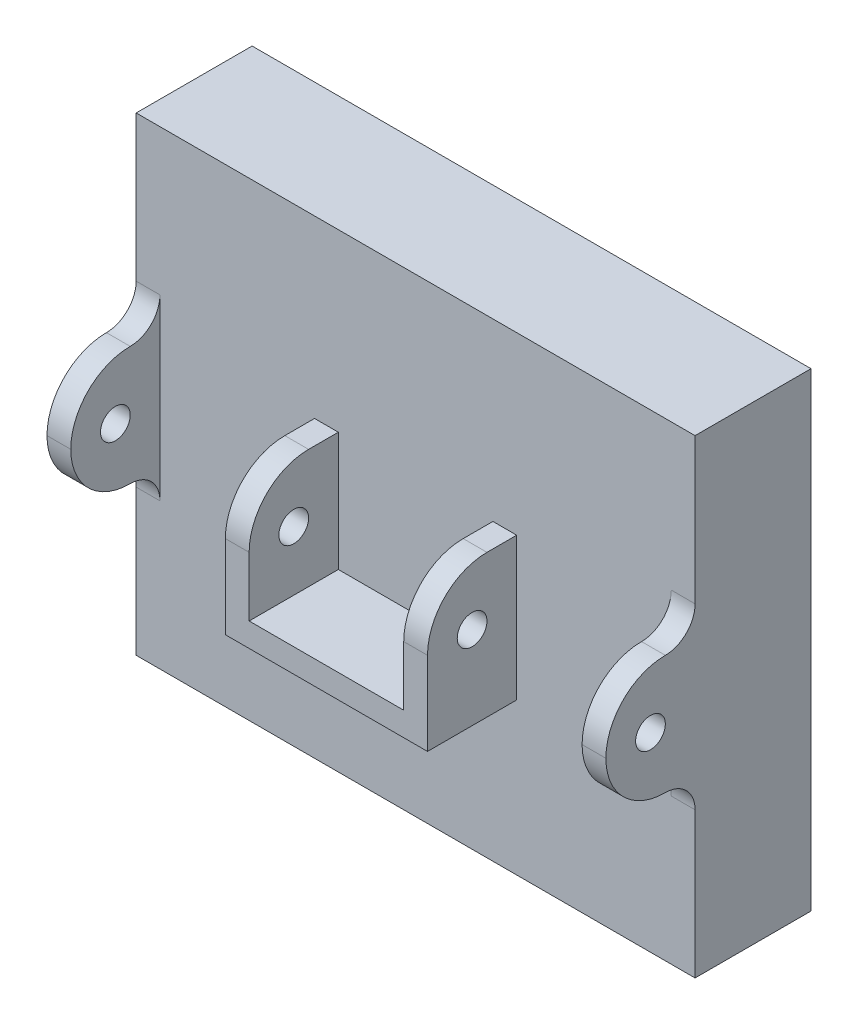
ISO-10303-21;
HEADER;
FILE_DESCRIPTION(('STEP AP214'),'2;1');
FILE_NAME('part.step','',(''),(''),'','','');
FILE_SCHEMA(('AUTOMOTIVE_DESIGN { 1 0 10303 214 1 1 1 1 }'));
ENDSEC;
DATA;
#1=APPLICATION_CONTEXT('core data for automotive mechanical design processes');
#2=APPLICATION_PROTOCOL_DEFINITION('international standard','automotive_design',2000,#1);
#3=PRODUCT_CONTEXT('',#1,'mechanical');
#4=PRODUCT('Part','Part','',(#3));
#5=PRODUCT_RELATED_PRODUCT_CATEGORY('part','',(#4));
#6=PRODUCT_DEFINITION_FORMATION('','',#4);
#7=PRODUCT_DEFINITION_CONTEXT('part definition',#1,'design');
#8=PRODUCT_DEFINITION('design','',#6,#7);
#9=PRODUCT_DEFINITION_SHAPE('','',#8);
#10=(LENGTH_UNIT() NAMED_UNIT(*) SI_UNIT(.MILLI.,.METRE.));
#11=(NAMED_UNIT(*) PLANE_ANGLE_UNIT() SI_UNIT($,.RADIAN.));
#12=(NAMED_UNIT(*) SI_UNIT($,.STERADIAN.) SOLID_ANGLE_UNIT());
#13=UNCERTAINTY_MEASURE_WITH_UNIT(LENGTH_MEASURE(1.E-05),#10,'distance_accuracy_value','');
#14=(GEOMETRIC_REPRESENTATION_CONTEXT(3) GLOBAL_UNCERTAINTY_ASSIGNED_CONTEXT((#13)) GLOBAL_UNIT_ASSIGNED_CONTEXT((#10,
#11,#12)) REPRESENTATION_CONTEXT('',''));
#15=CARTESIAN_POINT('',(0.,0.,0.));
#16=DIRECTION('',(0.,0.,1.));
#17=DIRECTION('',(1.,0.,0.));
#18=AXIS2_PLACEMENT_3D('',#15,#16,#17);
#19=CARTESIAN_POINT('',(0.,0.,39.));
#20=DIRECTION('',(0.,0.,-1.));
#21=DIRECTION('',(-1.,0.,0.));
#22=AXIS2_PLACEMENT_3D('',#19,#20,#21);
#23=PLANE('',#22);
#24=DIRECTION('',(0.,1.,0.));
#25=VECTOR('',#24,1.);
#26=CARTESIAN_POINT('',(34.,20.0000000000017,39.));
#27=LINE('',#26,#25);
#28=CARTESIAN_POINT('',(34.,-27.9999999999992,39.));
#29=VERTEX_POINT('',#28);
#30=CARTESIAN_POINT('',(34.,20.0000000000017,39.));
#31=VERTEX_POINT('',#30);
#32=EDGE_CURVE('E251',#29,#31,#27,.T.);
#33=ORIENTED_EDGE('',*,*,#32,.F.);
#34=DIRECTION('',(1.,0.,0.));
#35=VECTOR('',#34,1.);
#36=CARTESIAN_POINT('',(-34.,-27.9999999999992,39.));
#37=LINE('',#36,#35);
#38=CARTESIAN_POINT('',(-34.,-27.9999999999992,39.));
#39=VERTEX_POINT('',#38);
#40=EDGE_CURVE('E269',#39,#29,#37,.T.);
#41=ORIENTED_EDGE('',*,*,#40,.F.);
#42=DIRECTION('',(0.,-1.,0.));
#43=VECTOR('',#42,1.);
#44=CARTESIAN_POINT('',(-34.,-19.9999999999992,39.));
#45=LINE('',#44,#43);
#46=CARTESIAN_POINT('',(-34.,20.0000000000008,39.));
#47=VERTEX_POINT('',#46);
#48=EDGE_CURVE('E266',#47,#39,#45,.T.);
#49=ORIENTED_EDGE('',*,*,#48,.F.);
#50=DIRECTION('',(-1.,0.,0.));
#51=VECTOR('',#50,1.);
#52=CARTESIAN_POINT('',(-34.,20.0000000000008,39.));
#53=LINE('',#52,#51);
#54=CARTESIAN_POINT('',(-26.,20.0000000000008,39.));
#55=VERTEX_POINT('',#54);
#56=EDGE_CURVE('E263',#55,#47,#53,.T.);
#57=ORIENTED_EDGE('',*,*,#56,.F.);
#58=DIRECTION('',(0.,1.,0.));
#59=VECTOR('',#58,1.);
#60=CARTESIAN_POINT('',(-26.,20.0000000000008,39.));
#61=LINE('',#60,#59);
#62=CARTESIAN_POINT('',(-26.,-19.9999999999992,39.));
#63=VERTEX_POINT('',#62);
#64=EDGE_CURVE('E260',#63,#55,#61,.T.);
#65=ORIENTED_EDGE('',*,*,#64,.F.);
#66=DIRECTION('',(-1.,0.,0.));
#67=VECTOR('',#66,1.);
#68=CARTESIAN_POINT('',(-26.,-19.9999999999992,39.));
#69=LINE('',#68,#67);
#70=CARTESIAN_POINT('',(26.,-19.9999999999983,39.));
#71=VERTEX_POINT('',#70);
#72=EDGE_CURVE('E258',#71,#63,#69,.T.);
#73=ORIENTED_EDGE('',*,*,#72,.F.);
#74=DIRECTION('',(0.,-1.,0.));
#75=VECTOR('',#74,1.);
#76=CARTESIAN_POINT('',(26.,20.0000000000017,39.));
#77=LINE('',#76,#75);
#78=CARTESIAN_POINT('',(26.,20.0000000000017,39.));
#79=VERTEX_POINT('',#78);
#80=EDGE_CURVE('E232',#79,#71,#77,.T.);
#81=ORIENTED_EDGE('',*,*,#80,.F.);
#82=DIRECTION('',(-1.,0.,0.));
#83=VECTOR('',#82,1.);
#84=CARTESIAN_POINT('',(26.,20.0000000000017,39.));
#85=LINE('',#84,#83);
#86=EDGE_CURVE('E254',#31,#79,#85,.T.);
#87=ORIENTED_EDGE('',*,*,#86,.F.);
#88=EDGE_LOOP('',(#33,#41,#49,#57,#65,#73,#81,#87));
#89=FACE_BOUND('',#88,.T.);
#90=DIRECTION('',(0.,-1.,0.));
#91=VECTOR('',#90,1.);
#92=CARTESIAN_POINT('',(86.,20.0000000000025,39.));
#93=LINE('',#92,#91);
#94=CARTESIAN_POINT('',(86.,30.0000000000025,39.));
#95=VERTEX_POINT('',#94);
#96=CARTESIAN_POINT('',(86.,-29.9999999999975,39.));
#97=VERTEX_POINT('',#96);
#98=EDGE_CURVE('E48',#95,#97,#93,.T.);
#99=ORIENTED_EDGE('',*,*,#98,.F.);
#100=DIRECTION('',(-1.,0.,0.));
#101=VECTOR('',#100,1.);
#102=CARTESIAN_POINT('',(94.,30.0000000000025,39.));
#103=LINE('',#102,#101);
#104=CARTESIAN_POINT('',(94.,30.0000000000025,39.));
#105=VERTEX_POINT('',#104);
#106=EDGE_CURVE('E417',#95,#105,#103,.F.);
#107=ORIENTED_EDGE('',*,*,#106,.T.);
#108=DIRECTION('',(0.,1.,0.));
#109=VECTOR('',#108,1.);
#110=CARTESIAN_POINT('',(94.,-79.,39.));
#111=LINE('',#110,#109);
#112=CARTESIAN_POINT('',(94.,79.,39.));
#113=VERTEX_POINT('',#112);
#114=EDGE_CURVE('E322',#105,#113,#111,.T.);
#115=ORIENTED_EDGE('',*,*,#114,.T.);
#116=DIRECTION('',(-1.,0.,0.));
#117=VECTOR('',#116,1.);
#118=CARTESIAN_POINT('',(-94.,79.,39.));
#119=LINE('',#118,#117);
#120=CARTESIAN_POINT('',(-94.,79.,39.));
#121=VERTEX_POINT('',#120);
#122=EDGE_CURVE('E321',#113,#121,#119,.T.);
#123=ORIENTED_EDGE('',*,*,#122,.T.);
#124=DIRECTION('',(0.,-1.,0.));
#125=VECTOR('',#124,1.);
#126=CARTESIAN_POINT('',(-94.,-79.,39.));
#127=LINE('',#126,#125);
#128=CARTESIAN_POINT('',(-94.,30.,39.));
#129=VERTEX_POINT('',#128);
#130=EDGE_CURVE('E325',#121,#129,#127,.T.);
#131=ORIENTED_EDGE('',*,*,#130,.T.);
#132=DIRECTION('',(-1.,0.,0.));
#133=VECTOR('',#132,1.);
#134=CARTESIAN_POINT('',(-86.,30.,39.));
#135=LINE('',#134,#133);
#136=CARTESIAN_POINT('',(-86.,30.,39.));
#137=VERTEX_POINT('',#136);
#138=EDGE_CURVE('E412',#129,#137,#135,.F.);
#139=ORIENTED_EDGE('',*,*,#138,.T.);
#140=DIRECTION('',(0.,1.,0.));
#141=VECTOR('',#140,1.);
#142=CARTESIAN_POINT('',(-86.,20.,39.));
#143=LINE('',#142,#141);
#144=CARTESIAN_POINT('',(-86.,-30.,39.));
#145=VERTEX_POINT('',#144);
#146=EDGE_CURVE('E285',#145,#137,#143,.T.);
#147=ORIENTED_EDGE('',*,*,#146,.F.);
#148=DIRECTION('',(1.,0.,0.));
#149=VECTOR('',#148,1.);
#150=CARTESIAN_POINT('',(-94.,-30.,39.));
#151=LINE('',#150,#149);
#152=CARTESIAN_POINT('',(-94.,-30.,39.));
#153=VERTEX_POINT('',#152);
#154=EDGE_CURVE('E398',#145,#153,#151,.F.);
#155=ORIENTED_EDGE('',*,*,#154,.T.);
#156=CARTESIAN_POINT('',(-94.,-79.,39.));
#157=VERTEX_POINT('',#156);
#158=EDGE_CURVE('E324',#153,#157,#127,.T.);
#159=ORIENTED_EDGE('',*,*,#158,.T.);
#160=DIRECTION('',(1.,0.,0.));
#161=VECTOR('',#160,1.);
#162=CARTESIAN_POINT('',(-94.,-79.,39.));
#163=LINE('',#162,#161);
#164=CARTESIAN_POINT('',(94.,-79.,39.));
#165=VERTEX_POINT('',#164);
#166=EDGE_CURVE('E328',#157,#165,#163,.T.);
#167=ORIENTED_EDGE('',*,*,#166,.T.);
#168=CARTESIAN_POINT('',(94.,-29.9999999999975,39.));
#169=VERTEX_POINT('',#168);
#170=EDGE_CURVE('E318',#165,#169,#111,.T.);
#171=ORIENTED_EDGE('',*,*,#170,.T.);
#172=DIRECTION('',(1.,0.,0.));
#173=VECTOR('',#172,1.);
#174=CARTESIAN_POINT('',(86.,-29.9999999999975,39.));
#175=LINE('',#174,#173);
#176=EDGE_CURVE('E415',#169,#97,#175,.F.);
#177=ORIENTED_EDGE('',*,*,#176,.T.);
#178=EDGE_LOOP('',(#99,#107,#115,#123,#131,#139,#147,#155,#159,#167,#171,#177));
#179=FACE_BOUND('',#178,.T.);
#180=ADVANCED_FACE('F33',(#89,#179),#23,.F.);
#181=CARTESIAN_POINT('',(94.,-79.,39.));
#182=DIRECTION('',(-1.,0.,0.));
#183=DIRECTION('',(0.,0.,1.));
#184=AXIS2_PLACEMENT_3D('',#181,#182,#183);
#185=PLANE('',#184);
#186=CARTESIAN_POINT('',(94.,0.,54.));
#187=DIRECTION('',(-1.,0.,0.));
#188=DIRECTION('',(0.,0.,1.));
#189=AXIS2_PLACEMENT_3D('',#186,#187,#188);
#190=CIRCLE('',#189,5.);
#191=CARTESIAN_POINT('',(94.,0.,59.));
#192=VERTEX_POINT('',#191);
#193=EDGE_CURVE('E405',#192,#192,#190,.T.);
#194=ORIENTED_EDGE('',*,*,#193,.T.);
#195=EDGE_LOOP('',(#194));
#196=FACE_BOUND('',#195,.T.);
#197=CARTESIAN_POINT('',(94.,2.51881848711832E-12,49.));
#198=DIRECTION('',(-1.,0.,0.));
#199=DIRECTION('',(0.,0.,1.));
#200=AXIS2_PLACEMENT_3D('',#197,#198,#199);
#201=CIRCLE('',#200,20.);
#202=CARTESIAN_POINT('',(94.,20.0000000000025,49.));
#203=VERTEX_POINT('',#202);
#204=CARTESIAN_POINT('',(94.,2.51881848711832E-12,69.));
#205=VERTEX_POINT('',#204);
#206=EDGE_CURVE('E366',#203,#205,#201,.F.);
#207=ORIENTED_EDGE('',*,*,#206,.T.);
#208=CARTESIAN_POINT('',(94.,2.51881848711832E-12,49.));
#209=DIRECTION('',(-1.,0.,0.));
#210=DIRECTION('',(0.,0.,1.));
#211=AXIS2_PLACEMENT_3D('',#208,#209,#210);
#212=CIRCLE('',#211,20.);
#213=CARTESIAN_POINT('',(94.,-19.9999999999975,49.));
#214=VERTEX_POINT('',#213);
#215=EDGE_CURVE('E368',#205,#214,#212,.F.);
#216=ORIENTED_EDGE('',*,*,#215,.T.);
#217=CARTESIAN_POINT('',(94.,-29.9999999999975,49.));
#218=DIRECTION('',(-1.,0.,0.));
#219=DIRECTION('',(0.,0.,1.));
#220=AXIS2_PLACEMENT_3D('',#217,#218,#219);
#221=CIRCLE('',#220,10.);
#222=EDGE_CURVE('E423',#214,#169,#221,.T.);
#223=ORIENTED_EDGE('',*,*,#222,.T.);
#224=ORIENTED_EDGE('',*,*,#170,.F.);
#225=DIRECTION('',(0.,0.,-1.));
#226=VECTOR('',#225,1.);
#227=CARTESIAN_POINT('',(94.,-79.,39.));
#228=LINE('',#227,#226);
#229=CARTESIAN_POINT('',(94.,-79.,0.));
#230=VERTEX_POINT('',#229);
#231=EDGE_CURVE('E330',#165,#230,#228,.T.);
#232=ORIENTED_EDGE('',*,*,#231,.T.);
#233=DIRECTION('',(0.,1.,0.));
#234=VECTOR('',#233,1.);
#235=CARTESIAN_POINT('',(94.,-79.,0.));
#236=LINE('',#235,#234);
#237=CARTESIAN_POINT('',(94.,79.,0.));
#238=VERTEX_POINT('',#237);
#239=EDGE_CURVE('E317',#230,#238,#236,.T.);
#240=ORIENTED_EDGE('',*,*,#239,.T.);
#241=DIRECTION('',(0.,0.,-1.));
#242=VECTOR('',#241,1.);
#243=CARTESIAN_POINT('',(94.,79.,39.));
#244=LINE('',#243,#242);
#245=EDGE_CURVE('E347',#113,#238,#244,.T.);
#246=ORIENTED_EDGE('',*,*,#245,.F.);
#247=ORIENTED_EDGE('',*,*,#114,.F.);
#248=CARTESIAN_POINT('',(94.,30.0000000000025,49.));
#249=DIRECTION('',(-1.,0.,0.));
#250=DIRECTION('',(0.,0.,1.));
#251=AXIS2_PLACEMENT_3D('',#248,#249,#250);
#252=CIRCLE('',#251,10.);
#253=EDGE_CURVE('E421',#105,#203,#252,.T.);
#254=ORIENTED_EDGE('',*,*,#253,.T.);
#255=EDGE_LOOP('',(#207,#216,#223,#224,#232,#240,#246,#247,#254));
#256=FACE_BOUND('',#255,.T.);
#257=ADVANCED_FACE('F474',(#196,#256),#185,.F.);
#258=CARTESIAN_POINT('',(-94.,79.,39.));
#259=DIRECTION('',(0.,-1.,0.));
#260=DIRECTION('',(0.,0.,-1.));
#261=AXIS2_PLACEMENT_3D('',#258,#259,#260);
#262=PLANE('',#261);
#263=DIRECTION('',(-1.,0.,0.));
#264=VECTOR('',#263,1.);
#265=CARTESIAN_POINT('',(-94.,79.,0.));
#266=LINE('',#265,#264);
#267=CARTESIAN_POINT('',(-94.,79.,0.));
#268=VERTEX_POINT('',#267);
#269=EDGE_CURVE('E333',#238,#268,#266,.T.);
#270=ORIENTED_EDGE('',*,*,#269,.T.);
#271=DIRECTION('',(0.,0.,-1.));
#272=VECTOR('',#271,1.);
#273=CARTESIAN_POINT('',(-94.,79.,39.));
#274=LINE('',#273,#272);
#275=EDGE_CURVE('E344',#121,#268,#274,.T.);
#276=ORIENTED_EDGE('',*,*,#275,.F.);
#277=ORIENTED_EDGE('',*,*,#122,.F.);
#278=ORIENTED_EDGE('',*,*,#245,.T.);
#279=EDGE_LOOP('',(#270,#276,#277,#278));
#280=FACE_BOUND('',#279,.T.);
#281=ADVANCED_FACE('F477',(#280),#262,.F.);
#282=CARTESIAN_POINT('',(-94.,-79.,39.));
#283=DIRECTION('',(1.,0.,0.));
#284=DIRECTION('',(0.,0.,-1.));
#285=AXIS2_PLACEMENT_3D('',#282,#283,#284);
#286=PLANE('',#285);
#287=CARTESIAN_POINT('',(-94.,0.,54.));
#288=DIRECTION('',(-1.,0.,0.));
#289=DIRECTION('',(0.,0.,1.));
#290=AXIS2_PLACEMENT_3D('',#287,#288,#289);
#291=CIRCLE('',#290,5.);
#292=CARTESIAN_POINT('',(-94.,0.,59.));
#293=VERTEX_POINT('',#292);
#294=EDGE_CURVE('E410',#293,#293,#291,.T.);
#295=ORIENTED_EDGE('',*,*,#294,.F.);
#296=EDGE_LOOP('',(#295));
#297=FACE_BOUND('',#296,.T.);
#298=ORIENTED_EDGE('',*,*,#158,.F.);
#299=CARTESIAN_POINT('',(-94.,-30.,49.));
#300=DIRECTION('',(1.,0.,0.));
#301=DIRECTION('',(0.,0.,-1.));
#302=AXIS2_PLACEMENT_3D('',#299,#300,#301);
#303=CIRCLE('',#302,10.);
#304=CARTESIAN_POINT('',(-94.,-20.,49.));
#305=VERTEX_POINT('',#304);
#306=EDGE_CURVE('E11',#153,#305,#303,.T.);
#307=ORIENTED_EDGE('',*,*,#306,.T.);
#308=CARTESIAN_POINT('',(-94.,0.,49.));
#309=DIRECTION('',(1.,0.,0.));
#310=DIRECTION('',(0.,0.,-1.));
#311=AXIS2_PLACEMENT_3D('',#308,#309,#310);
#312=CIRCLE('',#311,20.);
#313=CARTESIAN_POINT('',(-94.,0.,69.));
#314=VERTEX_POINT('',#313);
#315=EDGE_CURVE('E393',#305,#314,#312,.F.);
#316=ORIENTED_EDGE('',*,*,#315,.T.);
#317=CARTESIAN_POINT('',(-94.,0.,49.));
#318=DIRECTION('',(1.,0.,0.));
#319=DIRECTION('',(0.,0.,-1.));
#320=AXIS2_PLACEMENT_3D('',#317,#318,#319);
#321=CIRCLE('',#320,20.);
#322=CARTESIAN_POINT('',(-94.,20.,49.));
#323=VERTEX_POINT('',#322);
#324=EDGE_CURVE('E390',#314,#323,#321,.F.);
#325=ORIENTED_EDGE('',*,*,#324,.T.);
#326=CARTESIAN_POINT('',(-94.,30.,49.));
#327=DIRECTION('',(1.,0.,0.));
#328=DIRECTION('',(0.,0.,-1.));
#329=AXIS2_PLACEMENT_3D('',#326,#327,#328);
#330=CIRCLE('',#329,10.);
#331=EDGE_CURVE('E427',#323,#129,#330,.T.);
#332=ORIENTED_EDGE('',*,*,#331,.T.);
#333=ORIENTED_EDGE('',*,*,#130,.F.);
#334=ORIENTED_EDGE('',*,*,#275,.T.);
#335=DIRECTION('',(0.,-1.,0.));
#336=VECTOR('',#335,1.);
#337=CARTESIAN_POINT('',(-94.,-79.,0.));
#338=LINE('',#337,#336);
#339=CARTESIAN_POINT('',(-94.,-79.,0.));
#340=VERTEX_POINT('',#339);
#341=EDGE_CURVE('E335',#268,#340,#338,.T.);
#342=ORIENTED_EDGE('',*,*,#341,.T.);
#343=DIRECTION('',(0.,0.,-1.));
#344=VECTOR('',#343,1.);
#345=CARTESIAN_POINT('',(-94.,-79.,39.));
#346=LINE('',#345,#344);
#347=EDGE_CURVE('E341',#157,#340,#346,.T.);
#348=ORIENTED_EDGE('',*,*,#347,.F.);
#349=EDGE_LOOP('',(#298,#307,#316,#325,#332,#333,#334,#342,#348));
#350=FACE_BOUND('',#349,.T.);
#351=ADVANCED_FACE('F441',(#297,#350),#286,.F.);
#352=CARTESIAN_POINT('',(-94.,-79.,39.));
#353=DIRECTION('',(0.,1.,0.));
#354=DIRECTION('',(0.,0.,1.));
#355=AXIS2_PLACEMENT_3D('',#352,#353,#354);
#356=PLANE('',#355);
#357=DIRECTION('',(1.,0.,0.));
#358=VECTOR('',#357,1.);
#359=CARTESIAN_POINT('',(-94.,-79.,0.));
#360=LINE('',#359,#358);
#361=EDGE_CURVE('E337',#340,#230,#360,.T.);
#362=ORIENTED_EDGE('',*,*,#361,.T.);
#363=ORIENTED_EDGE('',*,*,#231,.F.);
#364=ORIENTED_EDGE('',*,*,#166,.F.);
#365=ORIENTED_EDGE('',*,*,#347,.T.);
#366=EDGE_LOOP('',(#362,#363,#364,#365));
#367=FACE_BOUND('',#366,.T.);
#368=ADVANCED_FACE('F448',(#367),#356,.F.);
#369=CARTESIAN_POINT('',(0.,0.,0.));
#370=DIRECTION('',(0.,0.,-1.));
#371=DIRECTION('',(-1.,0.,0.));
#372=AXIS2_PLACEMENT_3D('',#369,#370,#371);
#373=PLANE('',#372);
#374=DIRECTION('',(0.,-1.,0.));
#375=VECTOR('',#374,1.);
#376=CARTESIAN_POINT('',(90.,0.,0.));
#377=LINE('',#376,#375);
#378=CARTESIAN_POINT('',(90.,75.,0.));
#379=VERTEX_POINT('',#378);
#380=CARTESIAN_POINT('',(90.,-75.,0.));
#381=VERTEX_POINT('',#380);
#382=EDGE_CURVE('E287',#379,#381,#377,.T.);
#383=ORIENTED_EDGE('',*,*,#382,.F.);
#384=DIRECTION('',(1.,0.,0.));
#385=VECTOR('',#384,1.);
#386=CARTESIAN_POINT('',(0.,75.,0.));
#387=LINE('',#386,#385);
#388=CARTESIAN_POINT('',(-90.,75.,0.));
#389=VERTEX_POINT('',#388);
#390=EDGE_CURVE('E301',#389,#379,#387,.T.);
#391=ORIENTED_EDGE('',*,*,#390,.F.);
#392=DIRECTION('',(0.,-1.,0.));
#393=VECTOR('',#392,1.);
#394=CARTESIAN_POINT('',(-90.,0.,0.));
#395=LINE('',#394,#393);
#396=CARTESIAN_POINT('',(-90.,-75.,0.));
#397=VERTEX_POINT('',#396);
#398=EDGE_CURVE('E304',#389,#397,#395,.T.);
#399=ORIENTED_EDGE('',*,*,#398,.T.);
#400=DIRECTION('',(1.,0.,0.));
#401=VECTOR('',#400,1.);
#402=CARTESIAN_POINT('',(0.,-75.,0.));
#403=LINE('',#402,#401);
#404=EDGE_CURVE('E292',#397,#381,#403,.T.);
#405=ORIENTED_EDGE('',*,*,#404,.T.);
#406=EDGE_LOOP('',(#383,#391,#399,#405));
#407=FACE_BOUND('',#406,.T.);
#408=ORIENTED_EDGE('',*,*,#239,.F.);
#409=ORIENTED_EDGE('',*,*,#361,.F.);
#410=ORIENTED_EDGE('',*,*,#341,.F.);
#411=ORIENTED_EDGE('',*,*,#269,.F.);
#412=EDGE_LOOP('',(#408,#409,#410,#411));
#413=FACE_BOUND('',#412,.T.);
#414=ADVANCED_FACE('F517',(#407,#413),#373,.T.);
#415=CARTESIAN_POINT('',(90.,0.,35.));
#416=DIRECTION('',(1.,0.,0.));
#417=DIRECTION('',(0.,0.,-1.));
#418=AXIS2_PLACEMENT_3D('',#415,#416,#417);
#419=PLANE('',#418);
#420=ORIENTED_EDGE('',*,*,#382,.T.);
#421=DIRECTION('',(0.,0.,-1.));
#422=VECTOR('',#421,1.);
#423=CARTESIAN_POINT('',(90.,-75.,35.));
#424=LINE('',#423,#422);
#425=CARTESIAN_POINT('',(90.,-75.,35.));
#426=VERTEX_POINT('',#425);
#427=EDGE_CURVE('E299',#426,#381,#424,.T.);
#428=ORIENTED_EDGE('',*,*,#427,.F.);
#429=DIRECTION('',(0.,-1.,0.));
#430=VECTOR('',#429,1.);
#431=CARTESIAN_POINT('',(90.,0.,35.));
#432=LINE('',#431,#430);
#433=CARTESIAN_POINT('',(90.,75.,35.));
#434=VERTEX_POINT('',#433);
#435=EDGE_CURVE('E288',#434,#426,#432,.T.);
#436=ORIENTED_EDGE('',*,*,#435,.F.);
#437=DIRECTION('',(0.,0.,-1.));
#438=VECTOR('',#437,1.);
#439=CARTESIAN_POINT('',(90.,75.,35.));
#440=LINE('',#439,#438);
#441=EDGE_CURVE('E315',#434,#379,#440,.T.);
#442=ORIENTED_EDGE('',*,*,#441,.T.);
#443=EDGE_LOOP('',(#420,#428,#436,#442));
#444=FACE_BOUND('',#443,.T.);
#445=ADVANCED_FACE('F515',(#444),#419,.F.);
#446=CARTESIAN_POINT('',(0.,75.,35.));
#447=DIRECTION('',(0.,1.,0.));
#448=DIRECTION('',(-1.,0.,0.));
#449=AXIS2_PLACEMENT_3D('',#446,#447,#448);
#450=PLANE('',#449);
#451=ORIENTED_EDGE('',*,*,#390,.T.);
#452=ORIENTED_EDGE('',*,*,#441,.F.);
#453=DIRECTION('',(1.,0.,0.));
#454=VECTOR('',#453,1.);
#455=CARTESIAN_POINT('',(0.,75.,35.));
#456=LINE('',#455,#454);
#457=CARTESIAN_POINT('',(-90.,75.,35.));
#458=VERTEX_POINT('',#457);
#459=EDGE_CURVE('E291',#458,#434,#456,.T.);
#460=ORIENTED_EDGE('',*,*,#459,.F.);
#461=DIRECTION('',(0.,0.,-1.));
#462=VECTOR('',#461,1.);
#463=CARTESIAN_POINT('',(-90.,75.,35.));
#464=LINE('',#463,#462);
#465=EDGE_CURVE('E313',#458,#389,#464,.T.);
#466=ORIENTED_EDGE('',*,*,#465,.T.);
#467=EDGE_LOOP('',(#451,#452,#460,#466));
#468=FACE_BOUND('',#467,.T.);
#469=ADVANCED_FACE('F742',(#468),#450,.F.);
#470=CARTESIAN_POINT('',(-90.,0.,35.));
#471=DIRECTION('',(1.,0.,0.));
#472=DIRECTION('',(0.,1.,0.));
#473=AXIS2_PLACEMENT_3D('',#470,#471,#472);
#474=PLANE('',#473);
#475=ORIENTED_EDGE('',*,*,#398,.F.);
#476=ORIENTED_EDGE('',*,*,#465,.F.);
#477=DIRECTION('',(0.,-1.,0.));
#478=VECTOR('',#477,1.);
#479=CARTESIAN_POINT('',(-90.,0.,35.));
#480=LINE('',#479,#478);
#481=CARTESIAN_POINT('',(-90.,-75.,35.));
#482=VERTEX_POINT('',#481);
#483=EDGE_CURVE('E295',#458,#482,#480,.T.);
#484=ORIENTED_EDGE('',*,*,#483,.T.);
#485=DIRECTION('',(0.,0.,-1.));
#486=VECTOR('',#485,1.);
#487=CARTESIAN_POINT('',(-90.,-75.,35.));
#488=LINE('',#487,#486);
#489=EDGE_CURVE('E311',#482,#397,#488,.T.);
#490=ORIENTED_EDGE('',*,*,#489,.T.);
#491=EDGE_LOOP('',(#475,#476,#484,#490));
#492=FACE_BOUND('',#491,.T.);
#493=ADVANCED_FACE('F732',(#492),#474,.T.);
#494=CARTESIAN_POINT('',(0.,-75.,35.));
#495=DIRECTION('',(0.,1.,0.));
#496=DIRECTION('',(-1.,0.,0.));
#497=AXIS2_PLACEMENT_3D('',#494,#495,#496);
#498=PLANE('',#497);
#499=ORIENTED_EDGE('',*,*,#404,.F.);
#500=ORIENTED_EDGE('',*,*,#489,.F.);
#501=DIRECTION('',(1.,0.,0.));
#502=VECTOR('',#501,1.);
#503=CARTESIAN_POINT('',(0.,-75.,35.));
#504=LINE('',#503,#502);
#505=EDGE_CURVE('E297',#482,#426,#504,.T.);
#506=ORIENTED_EDGE('',*,*,#505,.T.);
#507=ORIENTED_EDGE('',*,*,#427,.T.);
#508=EDGE_LOOP('',(#499,#500,#506,#507));
#509=FACE_BOUND('',#508,.T.);
#510=ADVANCED_FACE('F721',(#509),#498,.T.);
#511=CARTESIAN_POINT('',(0.,0.,35.));
#512=DIRECTION('',(0.,0.,1.));
#513=DIRECTION('',(1.,0.,0.));
#514=AXIS2_PLACEMENT_3D('',#511,#512,#513);
#515=PLANE('',#514);
#516=ORIENTED_EDGE('',*,*,#435,.T.);
#517=ORIENTED_EDGE('',*,*,#505,.F.);
#518=ORIENTED_EDGE('',*,*,#483,.F.);
#519=ORIENTED_EDGE('',*,*,#459,.T.);
#520=EDGE_LOOP('',(#516,#517,#518,#519));
#521=FACE_BOUND('',#520,.T.);
#522=ADVANCED_FACE('F716',(#521),#515,.F.);
#523=CARTESIAN_POINT('',(-86.,20.,69.));
#524=DIRECTION('',(-1.,0.,0.));
#525=DIRECTION('',(0.,0.,1.));
#526=AXIS2_PLACEMENT_3D('',#523,#524,#525);
#527=PLANE('',#526);
#528=CARTESIAN_POINT('',(-86.,0.,54.));
#529=DIRECTION('',(-1.,0.,0.));
#530=DIRECTION('',(0.,0.,1.));
#531=AXIS2_PLACEMENT_3D('',#528,#529,#530);
#532=CIRCLE('',#531,5.);
#533=CARTESIAN_POINT('',(-86.,0.,59.));
#534=VERTEX_POINT('',#533);
#535=EDGE_CURVE('E811',#534,#534,#532,.T.);
#536=ORIENTED_EDGE('',*,*,#535,.T.);
#537=EDGE_LOOP('',(#536));
#538=FACE_BOUND('',#537,.T.);
#539=CARTESIAN_POINT('',(-86.,0.,49.));
#540=DIRECTION('',(-1.,0.,0.));
#541=DIRECTION('',(0.,0.,1.));
#542=AXIS2_PLACEMENT_3D('',#539,#540,#541);
#543=CIRCLE('',#542,20.);
#544=CARTESIAN_POINT('',(-86.,20.,49.));
#545=VERTEX_POINT('',#544);
#546=CARTESIAN_POINT('',(-86.,0.,69.));
#547=VERTEX_POINT('',#546);
#548=EDGE_CURVE('E382',#545,#547,#543,.F.);
#549=ORIENTED_EDGE('',*,*,#548,.T.);
#550=CARTESIAN_POINT('',(-86.,0.,49.));
#551=DIRECTION('',(-1.,0.,0.));
#552=DIRECTION('',(0.,0.,1.));
#553=AXIS2_PLACEMENT_3D('',#550,#551,#552);
#554=CIRCLE('',#553,20.);
#555=CARTESIAN_POINT('',(-86.,-20.,49.));
#556=VERTEX_POINT('',#555);
#557=EDGE_CURVE('E384',#547,#556,#554,.F.);
#558=ORIENTED_EDGE('',*,*,#557,.T.);
#559=CARTESIAN_POINT('',(-86.,-30.,49.));
#560=DIRECTION('',(-1.,0.,0.));
#561=DIRECTION('',(0.,0.,1.));
#562=AXIS2_PLACEMENT_3D('',#559,#560,#561);
#563=CIRCLE('',#562,10.);
#564=EDGE_CURVE('E41',#556,#145,#563,.T.);
#565=ORIENTED_EDGE('',*,*,#564,.T.);
#566=ORIENTED_EDGE('',*,*,#146,.T.);
#567=CARTESIAN_POINT('',(-86.,30.,49.));
#568=DIRECTION('',(-1.,0.,0.));
#569=DIRECTION('',(0.,0.,1.));
#570=AXIS2_PLACEMENT_3D('',#567,#568,#569);
#571=CIRCLE('',#570,10.);
#572=EDGE_CURVE('E429',#137,#545,#571,.T.);
#573=ORIENTED_EDGE('',*,*,#572,.T.);
#574=EDGE_LOOP('',(#549,#558,#565,#566,#573));
#575=FACE_BOUND('',#574,.T.);
#576=ADVANCED_FACE('F433',(#538,#575),#527,.F.);
#577=CARTESIAN_POINT('',(34.,20.0000000000017,69.));
#578=DIRECTION('',(-1.,0.,0.));
#579=DIRECTION('',(0.,0.,1.));
#580=AXIS2_PLACEMENT_3D('',#577,#578,#579);
#581=PLANE('',#580);
#582=CARTESIAN_POINT('',(34.,0.,54.));
#583=DIRECTION('',(-1.,0.,0.));
#584=DIRECTION('',(0.,0.,1.));
#585=AXIS2_PLACEMENT_3D('',#582,#583,#584);
#586=CIRCLE('',#585,5.);
#587=CARTESIAN_POINT('',(34.,0.,59.));
#588=VERTEX_POINT('',#587);
#589=EDGE_CURVE('E814',#588,#588,#586,.T.);
#590=ORIENTED_EDGE('',*,*,#589,.T.);
#591=EDGE_LOOP('',(#590));
#592=FACE_BOUND('',#591,.T.);
#593=DIRECTION('',(0.,0.,-1.));
#594=VECTOR('',#593,1.);
#595=CARTESIAN_POINT('',(34.,20.0000000000017,69.));
#596=LINE('',#595,#594);
#597=CARTESIAN_POINT('',(34.,20.0000000000017,49.));
#598=VERTEX_POINT('',#597);
#599=EDGE_CURVE('E283',#598,#31,#596,.T.);
#600=ORIENTED_EDGE('',*,*,#599,.F.);
#601=CARTESIAN_POINT('',(34.,1.67921232474555E-12,49.));
#602=DIRECTION('',(-1.,0.,0.));
#603=DIRECTION('',(0.,0.,1.));
#604=AXIS2_PLACEMENT_3D('',#601,#602,#603);
#605=CIRCLE('',#604,20.);
#606=CARTESIAN_POINT('',(34.,1.67921232474555E-12,69.));
#607=VERTEX_POINT('',#606);
#608=EDGE_CURVE('E358',#598,#607,#605,.F.);
#609=ORIENTED_EDGE('',*,*,#608,.T.);
#610=DIRECTION('',(0.,1.,0.));
#611=VECTOR('',#610,1.);
#612=CARTESIAN_POINT('',(34.,-19.9999999999983,69.));
#613=LINE('',#612,#611);
#614=CARTESIAN_POINT('',(34.,-27.9999999999992,69.));
#615=VERTEX_POINT('',#614);
#616=EDGE_CURVE('E225',#615,#607,#613,.T.);
#617=ORIENTED_EDGE('',*,*,#616,.F.);
#618=DIRECTION('',(0.,0.,-1.));
#619=VECTOR('',#618,1.);
#620=CARTESIAN_POINT('',(34.,-27.9999999999992,69.));
#621=LINE('',#620,#619);
#622=EDGE_CURVE('E250',#615,#29,#621,.T.);
#623=ORIENTED_EDGE('',*,*,#622,.T.);
#624=ORIENTED_EDGE('',*,*,#32,.T.);
#625=EDGE_LOOP('',(#600,#609,#617,#623,#624));
#626=FACE_BOUND('',#625,.T.);
#627=ADVANCED_FACE('F656',(#592,#626),#581,.F.);
#628=CARTESIAN_POINT('',(26.,20.0000000000017,69.));
#629=DIRECTION('',(0.,-1.,0.));
#630=DIRECTION('',(0.,0.,-1.));
#631=AXIS2_PLACEMENT_3D('',#628,#629,#630);
#632=PLANE('',#631);
#633=DIRECTION('',(0.,0.,-1.));
#634=VECTOR('',#633,1.);
#635=CARTESIAN_POINT('',(26.,20.0000000000017,69.));
#636=LINE('',#635,#634);
#637=CARTESIAN_POINT('',(26.,20.0000000000017,49.));
#638=VERTEX_POINT('',#637);
#639=EDGE_CURVE('E235',#638,#79,#636,.T.);
#640=ORIENTED_EDGE('',*,*,#639,.F.);
#641=DIRECTION('',(-1.,0.,0.));
#642=VECTOR('',#641,1.);
#643=CARTESIAN_POINT('',(34.,20.0000000000017,49.));
#644=LINE('',#643,#642);
#645=EDGE_CURVE('E356',#638,#598,#644,.F.);
#646=ORIENTED_EDGE('',*,*,#645,.T.);
#647=ORIENTED_EDGE('',*,*,#599,.T.);
#648=ORIENTED_EDGE('',*,*,#86,.T.);
#649=EDGE_LOOP('',(#640,#646,#647,#648));
#650=FACE_BOUND('',#649,.T.);
#651=ADVANCED_FACE('F648',(#650),#632,.F.);
#652=CARTESIAN_POINT('',(26.,20.0000000000017,69.));
#653=DIRECTION('',(1.,0.,0.));
#654=DIRECTION('',(0.,0.,-1.));
#655=AXIS2_PLACEMENT_3D('',#652,#653,#654);
#656=PLANE('',#655);
#657=CARTESIAN_POINT('',(26.,0.,54.));
#658=DIRECTION('',(1.,0.,0.));
#659=DIRECTION('',(0.,0.,-1.));
#660=AXIS2_PLACEMENT_3D('',#657,#658,#659);
#661=CIRCLE('',#660,5.);
#662=CARTESIAN_POINT('',(26.,0.,49.));
#663=VERTEX_POINT('',#662);
#664=EDGE_CURVE('E840',#663,#663,#661,.T.);
#665=ORIENTED_EDGE('',*,*,#664,.T.);
#666=EDGE_LOOP('',(#665));
#667=FACE_BOUND('',#666,.T.);
#668=DIRECTION('',(0.,-1.,0.));
#669=VECTOR('',#668,1.);
#670=CARTESIAN_POINT('',(26.,20.0000000000017,69.));
#671=LINE('',#670,#669);
#672=CARTESIAN_POINT('',(26.,1.67921232474555E-12,69.));
#673=VERTEX_POINT('',#672);
#674=CARTESIAN_POINT('',(26.,-19.9999999999983,69.));
#675=VERTEX_POINT('',#674);
#676=EDGE_CURVE('E214',#673,#675,#671,.T.);
#677=ORIENTED_EDGE('',*,*,#676,.F.);
#678=CARTESIAN_POINT('',(26.,1.67921232474555E-12,49.));
#679=DIRECTION('',(1.,0.,0.));
#680=DIRECTION('',(0.,0.,-1.));
#681=AXIS2_PLACEMENT_3D('',#678,#679,#680);
#682=CIRCLE('',#681,20.);
#683=EDGE_CURVE('E354',#673,#638,#682,.F.);
#684=ORIENTED_EDGE('',*,*,#683,.T.);
#685=ORIENTED_EDGE('',*,*,#639,.T.);
#686=ORIENTED_EDGE('',*,*,#80,.T.);
#687=DIRECTION('',(0.,0.,-1.));
#688=VECTOR('',#687,1.);
#689=CARTESIAN_POINT('',(26.,-19.9999999999983,69.));
#690=LINE('',#689,#688);
#691=EDGE_CURVE('E229',#675,#71,#690,.T.);
#692=ORIENTED_EDGE('',*,*,#691,.F.);
#693=EDGE_LOOP('',(#677,#684,#685,#686,#692));
#694=FACE_BOUND('',#693,.T.);
#695=ADVANCED_FACE('F230',(#667,#694),#656,.F.);
#696=CARTESIAN_POINT('',(-26.,-19.9999999999992,69.));
#697=DIRECTION('',(0.,-1.,0.));
#698=DIRECTION('',(1.,0.,0.));
#699=AXIS2_PLACEMENT_3D('',#696,#697,#698);
#700=PLANE('',#699);
#701=ORIENTED_EDGE('',*,*,#72,.T.);
#702=DIRECTION('',(0.,0.,-1.));
#703=VECTOR('',#702,1.);
#704=CARTESIAN_POINT('',(-26.,-19.9999999999992,69.));
#705=LINE('',#704,#703);
#706=CARTESIAN_POINT('',(-26.,-19.9999999999992,69.));
#707=VERTEX_POINT('',#706);
#708=EDGE_CURVE('E236',#707,#63,#705,.T.);
#709=ORIENTED_EDGE('',*,*,#708,.F.);
#710=DIRECTION('',(-1.,0.,0.));
#711=VECTOR('',#710,1.);
#712=CARTESIAN_POINT('',(-26.,-19.9999999999992,69.));
#713=LINE('',#712,#711);
#714=EDGE_CURVE('E220',#675,#707,#713,.T.);
#715=ORIENTED_EDGE('',*,*,#714,.F.);
#716=ORIENTED_EDGE('',*,*,#691,.T.);
#717=EDGE_LOOP('',(#701,#709,#715,#716));
#718=FACE_BOUND('',#717,.T.);
#719=ADVANCED_FACE('F238',(#718),#700,.F.);
#720=CARTESIAN_POINT('',(-26.,20.0000000000008,69.));
#721=DIRECTION('',(-1.,0.,0.));
#722=DIRECTION('',(0.,0.,1.));
#723=AXIS2_PLACEMENT_3D('',#720,#721,#722);
#724=PLANE('',#723);
#725=CARTESIAN_POINT('',(-26.,0.,54.));
#726=DIRECTION('',(-1.,0.,0.));
#727=DIRECTION('',(0.,0.,1.));
#728=AXIS2_PLACEMENT_3D('',#725,#726,#727);
#729=CIRCLE('',#728,5.);
#730=CARTESIAN_POINT('',(-26.,0.,59.));
#731=VERTEX_POINT('',#730);
#732=EDGE_CURVE('E843',#731,#731,#729,.T.);
#733=ORIENTED_EDGE('',*,*,#732,.T.);
#734=EDGE_LOOP('',(#733));
#735=FACE_BOUND('',#734,.T.);
#736=DIRECTION('',(0.,0.,-1.));
#737=VECTOR('',#736,1.);
#738=CARTESIAN_POINT('',(-26.,20.0000000000008,69.));
#739=LINE('',#738,#737);
#740=CARTESIAN_POINT('',(-26.,20.0000000000008,49.));
#741=VERTEX_POINT('',#740);
#742=EDGE_CURVE('E279',#741,#55,#739,.T.);
#743=ORIENTED_EDGE('',*,*,#742,.F.);
#744=CARTESIAN_POINT('',(-26.,8.43075609324728E-13,49.));
#745=DIRECTION('',(-1.,0.,0.));
#746=DIRECTION('',(0.,0.,1.));
#747=AXIS2_PLACEMENT_3D('',#744,#745,#746);
#748=CIRCLE('',#747,20.);
#749=CARTESIAN_POINT('',(-26.,8.43075609324728E-13,69.));
#750=VERTEX_POINT('',#749);
#751=EDGE_CURVE('E364',#741,#750,#748,.F.);
#752=ORIENTED_EDGE('',*,*,#751,.T.);
#753=DIRECTION('',(0.,1.,0.));
#754=VECTOR('',#753,1.);
#755=CARTESIAN_POINT('',(-26.,20.0000000000008,69.));
#756=LINE('',#755,#754);
#757=EDGE_CURVE('E241',#707,#750,#756,.T.);
#758=ORIENTED_EDGE('',*,*,#757,.F.);
#759=ORIENTED_EDGE('',*,*,#708,.T.);
#760=ORIENTED_EDGE('',*,*,#64,.T.);
#761=EDGE_LOOP('',(#743,#752,#758,#759,#760));
#762=FACE_BOUND('',#761,.T.);
#763=ADVANCED_FACE('F631',(#735,#762),#724,.F.);
#764=CARTESIAN_POINT('',(-34.,20.0000000000008,69.));
#765=DIRECTION('',(0.,-1.,0.));
#766=DIRECTION('',(0.,0.,-1.));
#767=AXIS2_PLACEMENT_3D('',#764,#765,#766);
#768=PLANE('',#767);
#769=DIRECTION('',(0.,0.,-1.));
#770=VECTOR('',#769,1.);
#771=CARTESIAN_POINT('',(-34.,20.0000000000008,69.));
#772=LINE('',#771,#770);
#773=CARTESIAN_POINT('',(-34.,20.0000000000008,49.));
#774=VERTEX_POINT('',#773);
#775=EDGE_CURVE('E277',#774,#47,#772,.T.);
#776=ORIENTED_EDGE('',*,*,#775,.F.);
#777=DIRECTION('',(-1.,0.,0.));
#778=VECTOR('',#777,1.);
#779=CARTESIAN_POINT('',(-26.,20.0000000000008,49.));
#780=LINE('',#779,#778);
#781=EDGE_CURVE('E362',#774,#741,#780,.F.);
#782=ORIENTED_EDGE('',*,*,#781,.T.);
#783=ORIENTED_EDGE('',*,*,#742,.T.);
#784=ORIENTED_EDGE('',*,*,#56,.T.);
#785=EDGE_LOOP('',(#776,#782,#783,#784));
#786=FACE_BOUND('',#785,.T.);
#787=ADVANCED_FACE('F621',(#786),#768,.F.);
#788=CARTESIAN_POINT('',(-34.,-19.9999999999992,69.));
#789=DIRECTION('',(1.,0.,0.));
#790=DIRECTION('',(0.,0.,-1.));
#791=AXIS2_PLACEMENT_3D('',#788,#789,#790);
#792=PLANE('',#791);
#793=CARTESIAN_POINT('',(-34.,0.,54.));
#794=DIRECTION('',(1.,0.,0.));
#795=DIRECTION('',(0.,0.,-1.));
#796=AXIS2_PLACEMENT_3D('',#793,#794,#795);
#797=CIRCLE('',#796,5.);
#798=CARTESIAN_POINT('',(-34.,0.,49.));
#799=VERTEX_POINT('',#798);
#800=EDGE_CURVE('E409',#799,#799,#797,.T.);
#801=ORIENTED_EDGE('',*,*,#800,.T.);
#802=EDGE_LOOP('',(#801));
#803=FACE_BOUND('',#802,.T.);
#804=DIRECTION('',(0.,-1.,0.));
#805=VECTOR('',#804,1.);
#806=CARTESIAN_POINT('',(-34.,20.0000000000008,69.));
#807=LINE('',#806,#805);
#808=CARTESIAN_POINT('',(-34.,8.43075609324728E-13,69.));
#809=VERTEX_POINT('',#808);
#810=CARTESIAN_POINT('',(-34.,-27.9999999999992,69.));
#811=VERTEX_POINT('',#810);
#812=EDGE_CURVE('E243',#809,#811,#807,.T.);
#813=ORIENTED_EDGE('',*,*,#812,.F.);
#814=CARTESIAN_POINT('',(-34.,8.43075609324728E-13,49.));
#815=DIRECTION('',(1.,0.,0.));
#816=DIRECTION('',(0.,0.,-1.));
#817=AXIS2_PLACEMENT_3D('',#814,#815,#816);
#818=CIRCLE('',#817,20.);
#819=EDGE_CURVE('E360',#809,#774,#818,.F.);
#820=ORIENTED_EDGE('',*,*,#819,.T.);
#821=ORIENTED_EDGE('',*,*,#775,.T.);
#822=ORIENTED_EDGE('',*,*,#48,.T.);
#823=DIRECTION('',(0.,0.,-1.));
#824=VECTOR('',#823,1.);
#825=CARTESIAN_POINT('',(-34.,-27.9999999999992,69.));
#826=LINE('',#825,#824);
#827=EDGE_CURVE('E274',#811,#39,#826,.T.);
#828=ORIENTED_EDGE('',*,*,#827,.F.);
#829=EDGE_LOOP('',(#813,#820,#821,#822,#828));
#830=FACE_BOUND('',#829,.T.);
#831=ADVANCED_FACE('F615',(#803,#830),#792,.F.);
#832=CARTESIAN_POINT('',(-34.,-27.9999999999992,69.));
#833=DIRECTION('',(0.,1.,0.));
#834=DIRECTION('',(0.,0.,1.));
#835=AXIS2_PLACEMENT_3D('',#832,#833,#834);
#836=PLANE('',#835);
#837=ORIENTED_EDGE('',*,*,#40,.T.);
#838=ORIENTED_EDGE('',*,*,#622,.F.);
#839=DIRECTION('',(1.,0.,0.));
#840=VECTOR('',#839,1.);
#841=CARTESIAN_POINT('',(-34.,-27.9999999999992,69.));
#842=LINE('',#841,#840);
#843=EDGE_CURVE('E248',#811,#615,#842,.T.);
#844=ORIENTED_EDGE('',*,*,#843,.F.);
#845=ORIENTED_EDGE('',*,*,#827,.T.);
#846=EDGE_LOOP('',(#837,#838,#844,#845));
#847=FACE_BOUND('',#846,.T.);
#848=ADVANCED_FACE('F620',(#847),#836,.F.);
#849=CARTESIAN_POINT('',(0.,0.,69.));
#850=DIRECTION('',(0.,0.,1.));
#851=DIRECTION('',(1.,0.,0.));
#852=AXIS2_PLACEMENT_3D('',#849,#850,#851);
#853=PLANE('',#852);
#854=ORIENTED_EDGE('',*,*,#616,.T.);
#855=DIRECTION('',(-1.,0.,0.));
#856=VECTOR('',#855,1.);
#857=CARTESIAN_POINT('',(26.,1.67921232474555E-12,69.));
#858=LINE('',#857,#856);
#859=EDGE_CURVE('E223',#607,#673,#858,.T.);
#860=ORIENTED_EDGE('',*,*,#859,.T.);
#861=ORIENTED_EDGE('',*,*,#676,.T.);
#862=ORIENTED_EDGE('',*,*,#714,.T.);
#863=ORIENTED_EDGE('',*,*,#757,.T.);
#864=DIRECTION('',(-1.,0.,0.));
#865=VECTOR('',#864,1.);
#866=CARTESIAN_POINT('',(-34.,8.43075609324728E-13,69.));
#867=LINE('',#866,#865);
#868=EDGE_CURVE('E350',#750,#809,#867,.T.);
#869=ORIENTED_EDGE('',*,*,#868,.T.);
#870=ORIENTED_EDGE('',*,*,#812,.T.);
#871=ORIENTED_EDGE('',*,*,#843,.T.);
#872=EDGE_LOOP('',(#854,#860,#861,#862,#863,#869,#870,#871));
#873=FACE_BOUND('',#872,.T.);
#874=ADVANCED_FACE('F217',(#873),#853,.T.);
#875=CARTESIAN_POINT('',(86.,20.0000000000025,69.));
#876=DIRECTION('',(1.,0.,0.));
#877=DIRECTION('',(0.,0.,-1.));
#878=AXIS2_PLACEMENT_3D('',#875,#876,#877);
#879=PLANE('',#878);
#880=CARTESIAN_POINT('',(86.,0.,54.));
#881=DIRECTION('',(1.,0.,0.));
#882=DIRECTION('',(0.,0.,-1.));
#883=AXIS2_PLACEMENT_3D('',#880,#881,#882);
#884=CIRCLE('',#883,5.);
#885=CARTESIAN_POINT('',(86.,0.,49.));
#886=VERTEX_POINT('',#885);
#887=EDGE_CURVE('E406',#886,#886,#884,.T.);
#888=ORIENTED_EDGE('',*,*,#887,.T.);
#889=EDGE_LOOP('',(#888));
#890=FACE_BOUND('',#889,.T.);
#891=ORIENTED_EDGE('',*,*,#98,.T.);
#892=CARTESIAN_POINT('',(86.,-29.9999999999975,49.));
#893=DIRECTION('',(1.,0.,0.));
#894=DIRECTION('',(0.,0.,-1.));
#895=AXIS2_PLACEMENT_3D('',#892,#893,#894);
#896=CIRCLE('',#895,10.);
#897=CARTESIAN_POINT('',(86.,-19.9999999999975,49.));
#898=VERTEX_POINT('',#897);
#899=EDGE_CURVE('E425',#97,#898,#896,.T.);
#900=ORIENTED_EDGE('',*,*,#899,.T.);
#901=CARTESIAN_POINT('',(86.,2.51534904016637E-12,49.));
#902=DIRECTION('',(1.,0.,0.));
#903=DIRECTION('',(0.,0.,-1.));
#904=AXIS2_PLACEMENT_3D('',#901,#902,#903);
#905=CIRCLE('',#904,20.);
#906=CARTESIAN_POINT('',(86.,2.51881848711832E-12,69.));
#907=VERTEX_POINT('',#906);
#908=EDGE_CURVE('E377',#898,#907,#905,.F.);
#909=ORIENTED_EDGE('',*,*,#908,.T.);
#910=CARTESIAN_POINT('',(86.,2.51881848711832E-12,49.));
#911=DIRECTION('',(1.,0.,0.));
#912=DIRECTION('',(0.,0.,-1.));
#913=AXIS2_PLACEMENT_3D('',#910,#911,#912);
#914=CIRCLE('',#913,20.);
#915=CARTESIAN_POINT('',(86.,20.0000000000025,49.));
#916=VERTEX_POINT('',#915);
#917=EDGE_CURVE('E374',#907,#916,#914,.F.);
#918=ORIENTED_EDGE('',*,*,#917,.T.);
#919=CARTESIAN_POINT('',(86.,30.0000000000025,49.));
#920=DIRECTION('',(1.,0.,0.));
#921=DIRECTION('',(0.,0.,-1.));
#922=AXIS2_PLACEMENT_3D('',#919,#920,#921);
#923=CIRCLE('',#922,10.);
#924=EDGE_CURVE('E419',#916,#95,#923,.T.);
#925=ORIENTED_EDGE('',*,*,#924,.T.);
#926=EDGE_LOOP('',(#891,#900,#909,#918,#925));
#927=FACE_BOUND('',#926,.T.);
#928=ADVANCED_FACE('F457',(#890,#927),#879,.F.);
#929=CARTESIAN_POINT('',(0.,1.67921232474555E-12,49.));
#930=DIRECTION('',(1.,0.,0.));
#931=DIRECTION('',(0.,0.,-1.));
#932=AXIS2_PLACEMENT_3D('',#929,#930,#931);
#933=CYLINDRICAL_SURFACE('',#932,20.);
#934=ORIENTED_EDGE('',*,*,#608,.F.);
#935=ORIENTED_EDGE('',*,*,#645,.F.);
#936=ORIENTED_EDGE('',*,*,#683,.F.);
#937=ORIENTED_EDGE('',*,*,#859,.F.);
#938=EDGE_LOOP('',(#934,#935,#936,#937));
#939=FACE_BOUND('',#938,.T.);
#940=ADVANCED_FACE('F528',(#939),#933,.T.);
#941=CARTESIAN_POINT('',(0.,8.43075609324728E-13,49.));
#942=DIRECTION('',(1.,0.,0.));
#943=DIRECTION('',(0.,0.,-1.));
#944=AXIS2_PLACEMENT_3D('',#941,#942,#943);
#945=CYLINDRICAL_SURFACE('',#944,20.);
#946=ORIENTED_EDGE('',*,*,#751,.F.);
#947=ORIENTED_EDGE('',*,*,#781,.F.);
#948=ORIENTED_EDGE('',*,*,#819,.F.);
#949=ORIENTED_EDGE('',*,*,#868,.F.);
#950=EDGE_LOOP('',(#946,#947,#948,#949));
#951=FACE_BOUND('',#950,.T.);
#952=ADVANCED_FACE('F531',(#951),#945,.T.);
#953=CARTESIAN_POINT('',(0.,2.51881848711832E-12,49.));
#954=DIRECTION('',(-1.,0.,0.));
#955=DIRECTION('',(0.,0.,1.));
#956=AXIS2_PLACEMENT_3D('',#953,#954,#955);
#957=CYLINDRICAL_SURFACE('',#956,20.);
#958=DIRECTION('',(-1.,0.,0.));
#959=VECTOR('',#958,1.);
#960=CARTESIAN_POINT('',(86.,20.0000000000025,49.));
#961=LINE('',#960,#959);
#962=EDGE_CURVE('E379',#916,#203,#961,.F.);
#963=ORIENTED_EDGE('',*,*,#962,.F.);
#964=ORIENTED_EDGE('',*,*,#917,.F.);
#965=DIRECTION('',(-1.,0.,0.));
#966=VECTOR('',#965,1.);
#967=CARTESIAN_POINT('',(0.,2.51881848711832E-12,69.));
#968=LINE('',#967,#966);
#969=EDGE_CURVE('E399',#205,#907,#968,.T.);
#970=ORIENTED_EDGE('',*,*,#969,.F.);
#971=ORIENTED_EDGE('',*,*,#206,.F.);
#972=EDGE_LOOP('',(#963,#964,#970,#971));
#973=FACE_BOUND('',#972,.T.);
#974=ADVANCED_FACE('F466',(#973),#957,.T.);
#975=CARTESIAN_POINT('',(0.,2.47805248543287E-12,49.));
#976=DIRECTION('',(1.,0.,0.));
#977=DIRECTION('',(0.,1.,0.));
#978=AXIS2_PLACEMENT_3D('',#975,#976,#977);
#979=CYLINDRICAL_SURFACE('',#978,20.);
#980=ORIENTED_EDGE('',*,*,#908,.F.);
#981=DIRECTION('',(1.,0.,0.));
#982=VECTOR('',#981,1.);
#983=CARTESIAN_POINT('',(94.,-19.9999999999975,49.));
#984=LINE('',#983,#982);
#985=EDGE_CURVE('E371',#214,#898,#984,.F.);
#986=ORIENTED_EDGE('',*,*,#985,.F.);
#987=ORIENTED_EDGE('',*,*,#215,.F.);
#988=ORIENTED_EDGE('',*,*,#969,.T.);
#989=EDGE_LOOP('',(#980,#986,#987,#988));
#990=FACE_BOUND('',#989,.T.);
#991=ADVANCED_FACE('F460',(#990),#979,.T.);
#992=CARTESIAN_POINT('',(0.,0.,49.));
#993=DIRECTION('',(-1.,0.,0.));
#994=DIRECTION('',(0.,0.,1.));
#995=AXIS2_PLACEMENT_3D('',#992,#993,#994);
#996=CYLINDRICAL_SURFACE('',#995,20.);
#997=DIRECTION('',(-1.,0.,0.));
#998=VECTOR('',#997,1.);
#999=CARTESIAN_POINT('',(-94.,20.,49.));
#1000=LINE('',#999,#998);
#1001=EDGE_CURVE('E395',#323,#545,#1000,.F.);
#1002=ORIENTED_EDGE('',*,*,#1001,.F.);
#1003=ORIENTED_EDGE('',*,*,#324,.F.);
#1004=DIRECTION('',(-1.,0.,0.));
#1005=VECTOR('',#1004,1.);
#1006=CARTESIAN_POINT('',(0.,0.,69.));
#1007=LINE('',#1006,#1005);
#1008=EDGE_CURVE('E402',#547,#314,#1007,.T.);
#1009=ORIENTED_EDGE('',*,*,#1008,.F.);
#1010=ORIENTED_EDGE('',*,*,#548,.F.);
#1011=EDGE_LOOP('',(#1002,#1003,#1009,#1010));
#1012=FACE_BOUND('',#1011,.T.);
#1013=ADVANCED_FACE('F488',(#1012),#996,.T.);
#1014=CARTESIAN_POINT('',(0.,0.,49.));
#1015=DIRECTION('',(1.,0.,0.));
#1016=DIRECTION('',(0.,1.,0.));
#1017=AXIS2_PLACEMENT_3D('',#1014,#1015,#1016);
#1018=CYLINDRICAL_SURFACE('',#1017,20.);
#1019=ORIENTED_EDGE('',*,*,#315,.F.);
#1020=DIRECTION('',(1.,0.,0.));
#1021=VECTOR('',#1020,1.);
#1022=CARTESIAN_POINT('',(-86.,-20.,49.));
#1023=LINE('',#1022,#1021);
#1024=EDGE_CURVE('E387',#556,#305,#1023,.F.);
#1025=ORIENTED_EDGE('',*,*,#1024,.F.);
#1026=ORIENTED_EDGE('',*,*,#557,.F.);
#1027=ORIENTED_EDGE('',*,*,#1008,.T.);
#1028=EDGE_LOOP('',(#1019,#1025,#1026,#1027));
#1029=FACE_BOUND('',#1028,.T.);
#1030=ADVANCED_FACE('F491',(#1029),#1018,.T.);
#1031=CARTESIAN_POINT('',(114.,0.,54.));
#1032=DIRECTION('',(-1.,0.,0.));
#1033=DIRECTION('',(0.,0.,1.));
#1034=AXIS2_PLACEMENT_3D('',#1031,#1032,#1033);
#1035=CYLINDRICAL_SURFACE('',#1034,5.);
#1036=ORIENTED_EDGE('',*,*,#887,.F.);
#1037=EDGE_LOOP('',(#1036));
#1038=FACE_BOUND('',#1037,.T.);
#1039=ORIENTED_EDGE('',*,*,#193,.F.);
#1040=EDGE_LOOP('',(#1039));
#1041=FACE_BOUND('',#1040,.T.);
#1042=ADVANCED_FACE('F493',(#1038,#1041),#1035,.F.);
#1043=ORIENTED_EDGE('',*,*,#800,.F.);
#1044=EDGE_LOOP('',(#1043));
#1045=FACE_BOUND('',#1044,.T.);
#1046=ORIENTED_EDGE('',*,*,#732,.F.);
#1047=EDGE_LOOP('',(#1046));
#1048=FACE_BOUND('',#1047,.T.);
#1049=ADVANCED_FACE('F499',(#1045,#1048),#1035,.F.);
#1050=ORIENTED_EDGE('',*,*,#664,.F.);
#1051=EDGE_LOOP('',(#1050));
#1052=FACE_BOUND('',#1051,.T.);
#1053=ORIENTED_EDGE('',*,*,#589,.F.);
#1054=EDGE_LOOP('',(#1053));
#1055=FACE_BOUND('',#1054,.T.);
#1056=ADVANCED_FACE('F595',(#1052,#1055),#1035,.F.);
#1057=ORIENTED_EDGE('',*,*,#294,.T.);
#1058=EDGE_LOOP('',(#1057));
#1059=FACE_BOUND('',#1058,.T.);
#1060=ORIENTED_EDGE('',*,*,#535,.F.);
#1061=EDGE_LOOP('',(#1060));
#1062=FACE_BOUND('',#1061,.T.);
#1063=ADVANCED_FACE('F502',(#1059,#1062),#1035,.F.);
#1064=CARTESIAN_POINT('',(86.,30.0000000000025,49.));
#1065=DIRECTION('',(1.,0.,0.));
#1066=DIRECTION('',(0.,0.,-1.));
#1067=AXIS2_PLACEMENT_3D('',#1064,#1065,#1066);
#1068=CYLINDRICAL_SURFACE('',#1067,10.);
#1069=ORIENTED_EDGE('',*,*,#253,.F.);
#1070=ORIENTED_EDGE('',*,*,#106,.F.);
#1071=ORIENTED_EDGE('',*,*,#924,.F.);
#1072=ORIENTED_EDGE('',*,*,#962,.T.);
#1073=EDGE_LOOP('',(#1069,#1070,#1071,#1072));
#1074=FACE_BOUND('',#1073,.T.);
#1075=ADVANCED_FACE('F470',(#1074),#1068,.F.);
#1076=CARTESIAN_POINT('',(94.,-29.9999999999975,49.));
#1077=DIRECTION('',(-1.,0.,0.));
#1078=DIRECTION('',(0.,-1.,0.));
#1079=AXIS2_PLACEMENT_3D('',#1076,#1077,#1078);
#1080=CYLINDRICAL_SURFACE('',#1079,10.);
#1081=ORIENTED_EDGE('',*,*,#899,.F.);
#1082=ORIENTED_EDGE('',*,*,#176,.F.);
#1083=ORIENTED_EDGE('',*,*,#222,.F.);
#1084=ORIENTED_EDGE('',*,*,#985,.T.);
#1085=EDGE_LOOP('',(#1081,#1082,#1083,#1084));
#1086=FACE_BOUND('',#1085,.T.);
#1087=ADVANCED_FACE('F454',(#1086),#1080,.F.);
#1088=CARTESIAN_POINT('',(-94.,30.,49.));
#1089=DIRECTION('',(1.,0.,0.));
#1090=DIRECTION('',(0.,0.,-1.));
#1091=AXIS2_PLACEMENT_3D('',#1088,#1089,#1090);
#1092=CYLINDRICAL_SURFACE('',#1091,10.);
#1093=ORIENTED_EDGE('',*,*,#572,.F.);
#1094=ORIENTED_EDGE('',*,*,#138,.F.);
#1095=ORIENTED_EDGE('',*,*,#331,.F.);
#1096=ORIENTED_EDGE('',*,*,#1001,.T.);
#1097=EDGE_LOOP('',(#1093,#1094,#1095,#1096));
#1098=FACE_BOUND('',#1097,.T.);
#1099=ADVANCED_FACE('F483',(#1098),#1092,.F.);
#1100=CARTESIAN_POINT('',(-86.,-30.,49.));
#1101=DIRECTION('',(-1.,0.,0.));
#1102=DIRECTION('',(0.,-1.,0.));
#1103=AXIS2_PLACEMENT_3D('',#1100,#1101,#1102);
#1104=CYLINDRICAL_SURFACE('',#1103,10.);
#1105=ORIENTED_EDGE('',*,*,#306,.F.);
#1106=ORIENTED_EDGE('',*,*,#154,.F.);
#1107=ORIENTED_EDGE('',*,*,#564,.F.);
#1108=ORIENTED_EDGE('',*,*,#1024,.T.);
#1109=EDGE_LOOP('',(#1105,#1106,#1107,#1108));
#1110=FACE_BOUND('',#1109,.T.);
#1111=ADVANCED_FACE('F35',(#1110),#1104,.F.);
#1112=CLOSED_SHELL('',(#180,#257,#281,#351,#368,#414,#445,#469,#493,#510,#522,#576,#627,#651,
#695,#719,#763,#787,#831,#848,#874,#928,#940,#952,#974,#991,#1013,#1030,#1042,#1049,#1056,#1063,
#1075,#1087,#1099,#1111));
#1113=MANIFOLD_SOLID_BREP('B2',#1112);
#1114=ADVANCED_BREP_SHAPE_REPRESENTATION('',(#18,#1113),#14);
#1115=SHAPE_DEFINITION_REPRESENTATION(#9,#1114);
ENDSEC;
END-ISO-10303-21;
